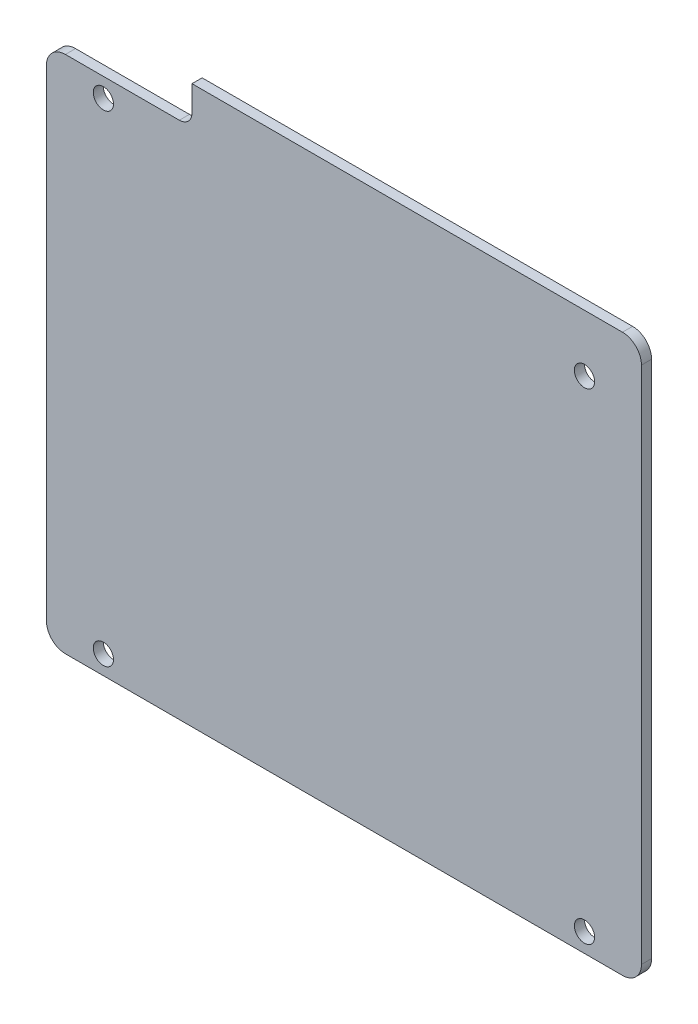
ISO-10303-21;
HEADER;
FILE_DESCRIPTION(('STEP AP214'),'2;1');
FILE_NAME('part.step','',(''),(''),'','','');
FILE_SCHEMA(('AUTOMOTIVE_DESIGN { 1 0 10303 214 1 1 1 1 }'));
ENDSEC;
DATA;
#1=APPLICATION_CONTEXT('core data for automotive mechanical design processes');
#2=APPLICATION_PROTOCOL_DEFINITION('international standard','automotive_design',2000,#1);
#3=PRODUCT_CONTEXT('',#1,'mechanical');
#4=PRODUCT('Part','Part','',(#3));
#5=PRODUCT_RELATED_PRODUCT_CATEGORY('part','',(#4));
#6=PRODUCT_DEFINITION_FORMATION('','',#4);
#7=PRODUCT_DEFINITION_CONTEXT('part definition',#1,'design');
#8=PRODUCT_DEFINITION('design','',#6,#7);
#9=PRODUCT_DEFINITION_SHAPE('','',#8);
#10=(LENGTH_UNIT() NAMED_UNIT(*) SI_UNIT(.MILLI.,.METRE.));
#11=(NAMED_UNIT(*) PLANE_ANGLE_UNIT() SI_UNIT($,.RADIAN.));
#12=(NAMED_UNIT(*) SI_UNIT($,.STERADIAN.) SOLID_ANGLE_UNIT());
#13=UNCERTAINTY_MEASURE_WITH_UNIT(LENGTH_MEASURE(1.E-05),#10,'distance_accuracy_value','');
#14=(GEOMETRIC_REPRESENTATION_CONTEXT(3) GLOBAL_UNCERTAINTY_ASSIGNED_CONTEXT((#13)) GLOBAL_UNIT_ASSIGNED_CONTEXT((#10,
#11,#12)) REPRESENTATION_CONTEXT('',''));
#15=CARTESIAN_POINT('',(0.,0.,0.));
#16=DIRECTION('',(0.,0.,1.));
#17=DIRECTION('',(1.,0.,0.));
#18=AXIS2_PLACEMENT_3D('',#15,#16,#17);
#19=CARTESIAN_POINT('',(-64.5653438799531,91.9518569300749,1.6));
#20=DIRECTION('',(1.,0.,0.));
#21=DIRECTION('',(0.,0.,-1.));
#22=AXIS2_PLACEMENT_3D('',#19,#20,#21);
#23=PLANE('',#22);
#24=DIRECTION('',(0.,-1.,0.));
#25=VECTOR('',#24,1.);
#26=CARTESIAN_POINT('',(-64.5653438799531,91.9518569300749,0.));
#27=LINE('',#26,#25);
#28=CARTESIAN_POINT('',(-64.5653438799531,91.9518569300749,0.));
#29=VERTEX_POINT('',#28);
#30=CARTESIAN_POINT('',(-64.5653438799531,87.9518569300749,0.));
#31=VERTEX_POINT('',#30);
#32=EDGE_CURVE('E147',#29,#31,#27,.T.);
#33=ORIENTED_EDGE('',*,*,#32,.T.);
#34=DIRECTION('',(0.,0.,-1.));
#35=VECTOR('',#34,1.);
#36=CARTESIAN_POINT('',(-64.5653438799531,87.9518569300749,1.6));
#37=LINE('',#36,#35);
#38=CARTESIAN_POINT('',(-64.5653438799531,87.9518569300749,1.6));
#39=VERTEX_POINT('',#38);
#40=EDGE_CURVE('E11',#39,#31,#37,.T.);
#41=ORIENTED_EDGE('',*,*,#40,.F.);
#42=DIRECTION('',(0.,-1.,0.));
#43=VECTOR('',#42,1.);
#44=CARTESIAN_POINT('',(-64.5653438799531,91.9518569300749,1.6));
#45=LINE('',#44,#43);
#46=CARTESIAN_POINT('',(-64.5653438799531,91.9518569300749,1.6));
#47=VERTEX_POINT('',#46);
#48=EDGE_CURVE('E169',#47,#39,#45,.T.);
#49=ORIENTED_EDGE('',*,*,#48,.F.);
#50=DIRECTION('',(0.,0.,-1.));
#51=VECTOR('',#50,1.);
#52=CARTESIAN_POINT('',(-64.5653438799531,91.9518569300749,1.6));
#53=LINE('',#52,#51);
#54=EDGE_CURVE('E143',#47,#29,#53,.T.);
#55=ORIENTED_EDGE('',*,*,#54,.T.);
#56=EDGE_LOOP('',(#33,#41,#49,#55));
#57=FACE_BOUND('',#56,.T.);
#58=ADVANCED_FACE('F32',(#57),#23,.F.);
#59=CARTESIAN_POINT('',(-66.5653438799531,87.9518569300749,1.6));
#60=DIRECTION('',(0.,0.,-1.));
#61=DIRECTION('',(-1.,0.,0.));
#62=AXIS2_PLACEMENT_3D('',#59,#60,#61);
#63=CYLINDRICAL_SURFACE('',#62,2.);
#64=CARTESIAN_POINT('',(-66.5653438799531,87.9518569300749,0.));
#65=DIRECTION('',(0.,0.,-1.));
#66=DIRECTION('',(-1.,0.,0.));
#67=AXIS2_PLACEMENT_3D('',#64,#65,#66);
#68=CIRCLE('',#67,2.);
#69=CARTESIAN_POINT('',(-66.5653438799531,85.9518569300749,0.));
#70=VERTEX_POINT('',#69);
#71=EDGE_CURVE('E150',#31,#70,#68,.T.);
#72=ORIENTED_EDGE('',*,*,#71,.T.);
#73=DIRECTION('',(0.,0.,-1.));
#74=VECTOR('',#73,1.);
#75=CARTESIAN_POINT('',(-66.5653438799531,85.9518569300749,1.6));
#76=LINE('',#75,#74);
#77=CARTESIAN_POINT('',(-66.5653438799531,85.9518569300749,1.6));
#78=VERTEX_POINT('',#77);
#79=EDGE_CURVE('E40',#78,#70,#76,.T.);
#80=ORIENTED_EDGE('',*,*,#79,.F.);
#81=CARTESIAN_POINT('',(-66.5653438799531,87.9518569300749,1.6));
#82=DIRECTION('',(0.,0.,-1.));
#83=DIRECTION('',(-1.,0.,0.));
#84=AXIS2_PLACEMENT_3D('',#81,#82,#83);
#85=CIRCLE('',#84,2.);
#86=EDGE_CURVE('E98',#39,#78,#85,.T.);
#87=ORIENTED_EDGE('',*,*,#86,.F.);
#88=ORIENTED_EDGE('',*,*,#40,.T.);
#89=EDGE_LOOP('',(#72,#80,#87,#88));
#90=FACE_BOUND('',#89,.T.);
#91=ADVANCED_FACE('F281',(#90),#63,.F.);
#92=CARTESIAN_POINT('',(-66.5653438799531,85.9518569300749,1.6));
#93=DIRECTION('',(0.,-1.,0.));
#94=DIRECTION('',(0.,0.,-1.));
#95=AXIS2_PLACEMENT_3D('',#92,#93,#94);
#96=PLANE('',#95);
#97=DIRECTION('',(-1.,0.,0.));
#98=VECTOR('',#97,1.);
#99=CARTESIAN_POINT('',(-66.5653438799531,85.9518569300749,0.));
#100=LINE('',#99,#98);
#101=CARTESIAN_POINT('',(-84.5653438799531,85.9518569300749,0.));
#102=VERTEX_POINT('',#101);
#103=EDGE_CURVE('E153',#70,#102,#100,.T.);
#104=ORIENTED_EDGE('',*,*,#103,.T.);
#105=DIRECTION('',(0.,0.,-1.));
#106=VECTOR('',#105,1.);
#107=CARTESIAN_POINT('',(-84.5653438799531,85.9518569300749,1.6));
#108=LINE('',#107,#106);
#109=CARTESIAN_POINT('',(-84.5653438799531,85.9518569300749,1.6));
#110=VERTEX_POINT('',#109);
#111=EDGE_CURVE('E185',#110,#102,#108,.T.);
#112=ORIENTED_EDGE('',*,*,#111,.F.);
#113=DIRECTION('',(-1.,0.,0.));
#114=VECTOR('',#113,1.);
#115=CARTESIAN_POINT('',(-66.5653438799531,85.9518569300749,1.6));
#116=LINE('',#115,#114);
#117=EDGE_CURVE('E193',#78,#110,#116,.T.);
#118=ORIENTED_EDGE('',*,*,#117,.F.);
#119=ORIENTED_EDGE('',*,*,#79,.T.);
#120=EDGE_LOOP('',(#104,#112,#118,#119));
#121=FACE_BOUND('',#120,.T.);
#122=ADVANCED_FACE('F191',(#121),#96,.F.);
#123=CARTESIAN_POINT('',(-84.5653438799531,82.9518569300749,1.6));
#124=DIRECTION('',(0.,0.,-1.));
#125=DIRECTION('',(-1.,0.,0.));
#126=AXIS2_PLACEMENT_3D('',#123,#124,#125);
#127=CYLINDRICAL_SURFACE('',#126,3.);
#128=CARTESIAN_POINT('',(-84.5653438799531,82.9518569300749,0.));
#129=DIRECTION('',(0.,0.,1.));
#130=DIRECTION('',(1.,0.,0.));
#131=AXIS2_PLACEMENT_3D('',#128,#129,#130);
#132=CIRCLE('',#131,3.);
#133=CARTESIAN_POINT('',(-87.5653438799531,82.9518569300748,0.));
#134=VERTEX_POINT('',#133);
#135=EDGE_CURVE('E155',#102,#134,#132,.T.);
#136=ORIENTED_EDGE('',*,*,#135,.T.);
#137=DIRECTION('',(0.,0.,-1.));
#138=VECTOR('',#137,1.);
#139=CARTESIAN_POINT('',(-87.5653438799531,82.9518569300748,1.6));
#140=LINE('',#139,#138);
#141=CARTESIAN_POINT('',(-87.5653438799531,82.9518569300748,1.6));
#142=VERTEX_POINT('',#141);
#143=EDGE_CURVE('E182',#142,#134,#140,.T.);
#144=ORIENTED_EDGE('',*,*,#143,.F.);
#145=CARTESIAN_POINT('',(-84.5653438799531,82.9518569300749,1.6));
#146=DIRECTION('',(0.,0.,1.));
#147=DIRECTION('',(1.,0.,0.));
#148=AXIS2_PLACEMENT_3D('',#145,#146,#147);
#149=CIRCLE('',#148,3.);
#150=EDGE_CURVE('E209',#110,#142,#149,.T.);
#151=ORIENTED_EDGE('',*,*,#150,.F.);
#152=ORIENTED_EDGE('',*,*,#111,.T.);
#153=EDGE_LOOP('',(#136,#144,#151,#152));
#154=FACE_BOUND('',#153,.T.);
#155=ADVANCED_FACE('F200',(#154),#127,.T.);
#156=CARTESIAN_POINT('',(-87.5653438799531,82.9518569300748,1.6));
#157=DIRECTION('',(1.,0.,0.));
#158=DIRECTION('',(0.,0.,-1.));
#159=AXIS2_PLACEMENT_3D('',#156,#157,#158);
#160=PLANE('',#159);
#161=DIRECTION('',(0.,-1.,0.));
#162=VECTOR('',#161,1.);
#163=CARTESIAN_POINT('',(-87.5653438799531,82.9518569300748,0.));
#164=LINE('',#163,#162);
#165=CARTESIAN_POINT('',(-87.5653438799531,6.95185693007492,0.));
#166=VERTEX_POINT('',#165);
#167=EDGE_CURVE('E157',#134,#166,#164,.T.);
#168=ORIENTED_EDGE('',*,*,#167,.T.);
#169=DIRECTION('',(0.,0.,-1.));
#170=VECTOR('',#169,1.);
#171=CARTESIAN_POINT('',(-87.5653438799531,6.95185693007492,1.6));
#172=LINE('',#171,#170);
#173=CARTESIAN_POINT('',(-87.5653438799531,6.95185693007492,1.6));
#174=VERTEX_POINT('',#173);
#175=EDGE_CURVE('E179',#174,#166,#172,.T.);
#176=ORIENTED_EDGE('',*,*,#175,.F.);
#177=DIRECTION('',(0.,-1.,0.));
#178=VECTOR('',#177,1.);
#179=CARTESIAN_POINT('',(-87.5653438799531,82.9518569300748,1.6));
#180=LINE('',#179,#178);
#181=EDGE_CURVE('E206',#142,#174,#180,.T.);
#182=ORIENTED_EDGE('',*,*,#181,.F.);
#183=ORIENTED_EDGE('',*,*,#143,.T.);
#184=EDGE_LOOP('',(#168,#176,#182,#183));
#185=FACE_BOUND('',#184,.T.);
#186=ADVANCED_FACE('F204',(#185),#160,.F.);
#187=CARTESIAN_POINT('',(-84.5653438799531,6.9518569300749,1.6));
#188=DIRECTION('',(0.,0.,-1.));
#189=DIRECTION('',(-1.,0.,0.));
#190=AXIS2_PLACEMENT_3D('',#187,#188,#189);
#191=CYLINDRICAL_SURFACE('',#190,3.);
#192=CARTESIAN_POINT('',(-84.5653438799531,6.9518569300749,0.));
#193=DIRECTION('',(0.,0.,1.));
#194=DIRECTION('',(-1.,0.,0.));
#195=AXIS2_PLACEMENT_3D('',#192,#193,#194);
#196=CIRCLE('',#195,3.);
#197=CARTESIAN_POINT('',(-84.5653438799531,3.9518569300749,0.));
#198=VERTEX_POINT('',#197);
#199=EDGE_CURVE('E159',#166,#198,#196,.T.);
#200=ORIENTED_EDGE('',*,*,#199,.T.);
#201=DIRECTION('',(0.,0.,-1.));
#202=VECTOR('',#201,1.);
#203=CARTESIAN_POINT('',(-84.5653438799531,3.9518569300749,1.6));
#204=LINE('',#203,#202);
#205=CARTESIAN_POINT('',(-84.5653438799531,3.9518569300749,1.6));
#206=VERTEX_POINT('',#205);
#207=EDGE_CURVE('E176',#206,#198,#204,.T.);
#208=ORIENTED_EDGE('',*,*,#207,.F.);
#209=CARTESIAN_POINT('',(-84.5653438799531,6.9518569300749,1.6));
#210=DIRECTION('',(0.,0.,1.));
#211=DIRECTION('',(-1.,0.,0.));
#212=AXIS2_PLACEMENT_3D('',#209,#210,#211);
#213=CIRCLE('',#212,3.);
#214=EDGE_CURVE('E208',#174,#206,#213,.T.);
#215=ORIENTED_EDGE('',*,*,#214,.F.);
#216=ORIENTED_EDGE('',*,*,#175,.T.);
#217=EDGE_LOOP('',(#200,#208,#215,#216));
#218=FACE_BOUND('',#217,.T.);
#219=ADVANCED_FACE('F294',(#218),#191,.T.);
#220=CARTESIAN_POINT('',(-84.5653438799531,3.9518569300749,1.6));
#221=DIRECTION('',(0.,1.,0.));
#222=DIRECTION('',(-1.,0.,0.));
#223=AXIS2_PLACEMENT_3D('',#220,#221,#222);
#224=PLANE('',#223);
#225=DIRECTION('',(1.,0.,0.));
#226=VECTOR('',#225,1.);
#227=CARTESIAN_POINT('',(-84.5653438799531,3.9518569300749,0.));
#228=LINE('',#227,#226);
#229=CARTESIAN_POINT('',(3.43465612004684,3.9518569300749,0.));
#230=VERTEX_POINT('',#229);
#231=EDGE_CURVE('E161',#198,#230,#228,.T.);
#232=ORIENTED_EDGE('',*,*,#231,.T.);
#233=DIRECTION('',(0.,0.,-1.));
#234=VECTOR('',#233,1.);
#235=CARTESIAN_POINT('',(3.43465612004684,3.9518569300749,1.6));
#236=LINE('',#235,#234);
#237=CARTESIAN_POINT('',(3.43465612004684,3.9518569300749,1.6));
#238=VERTEX_POINT('',#237);
#239=EDGE_CURVE('E173',#238,#230,#236,.T.);
#240=ORIENTED_EDGE('',*,*,#239,.F.);
#241=DIRECTION('',(1.,0.,0.));
#242=VECTOR('',#241,1.);
#243=CARTESIAN_POINT('',(-84.5653438799531,3.9518569300749,1.6));
#244=LINE('',#243,#242);
#245=EDGE_CURVE('E211',#206,#238,#244,.T.);
#246=ORIENTED_EDGE('',*,*,#245,.F.);
#247=ORIENTED_EDGE('',*,*,#207,.T.);
#248=EDGE_LOOP('',(#232,#240,#246,#247));
#249=FACE_BOUND('',#248,.T.);
#250=ADVANCED_FACE('F220',(#249),#224,.F.);
#251=CARTESIAN_POINT('',(3.43465612004684,6.9518569300749,1.6));
#252=DIRECTION('',(0.,0.,-1.));
#253=DIRECTION('',(-1.,0.,0.));
#254=AXIS2_PLACEMENT_3D('',#251,#252,#253);
#255=CYLINDRICAL_SURFACE('',#254,3.);
#256=CARTESIAN_POINT('',(3.43465612004684,6.9518569300749,0.));
#257=DIRECTION('',(0.,0.,1.));
#258=DIRECTION('',(1.,0.,0.));
#259=AXIS2_PLACEMENT_3D('',#256,#257,#258);
#260=CIRCLE('',#259,3.);
#261=CARTESIAN_POINT('',(6.43465612004684,6.9518569300749,0.));
#262=VERTEX_POINT('',#261);
#263=EDGE_CURVE('E163',#230,#262,#260,.T.);
#264=ORIENTED_EDGE('',*,*,#263,.T.);
#265=DIRECTION('',(0.,0.,-1.));
#266=VECTOR('',#265,1.);
#267=CARTESIAN_POINT('',(6.43465612004684,6.9518569300749,1.6));
#268=LINE('',#267,#266);
#269=CARTESIAN_POINT('',(6.43465612004684,6.9518569300749,1.6));
#270=VERTEX_POINT('',#269);
#271=EDGE_CURVE('E138',#270,#262,#268,.T.);
#272=ORIENTED_EDGE('',*,*,#271,.F.);
#273=CARTESIAN_POINT('',(3.43465612004684,6.9518569300749,1.6));
#274=DIRECTION('',(0.,0.,1.));
#275=DIRECTION('',(1.,0.,0.));
#276=AXIS2_PLACEMENT_3D('',#273,#274,#275);
#277=CIRCLE('',#276,3.);
#278=EDGE_CURVE('E127',#238,#270,#277,.T.);
#279=ORIENTED_EDGE('',*,*,#278,.F.);
#280=ORIENTED_EDGE('',*,*,#239,.T.);
#281=EDGE_LOOP('',(#264,#272,#279,#280));
#282=FACE_BOUND('',#281,.T.);
#283=ADVANCED_FACE('F224',(#282),#255,.T.);
#284=CARTESIAN_POINT('',(6.43465612004683,88.9518569300748,1.6));
#285=DIRECTION('',(-1.,0.,0.));
#286=DIRECTION('',(0.,-1.,0.));
#287=AXIS2_PLACEMENT_3D('',#284,#285,#286);
#288=PLANE('',#287);
#289=DIRECTION('',(0.,1.,0.));
#290=VECTOR('',#289,1.);
#291=CARTESIAN_POINT('',(6.43465612004683,88.9518569300748,0.));
#292=LINE('',#291,#290);
#293=CARTESIAN_POINT('',(6.43465612004683,88.9518569300748,0.));
#294=VERTEX_POINT('',#293);
#295=EDGE_CURVE('E136',#262,#294,#292,.T.);
#296=ORIENTED_EDGE('',*,*,#295,.T.);
#297=DIRECTION('',(0.,0.,-1.));
#298=VECTOR('',#297,1.);
#299=CARTESIAN_POINT('',(6.43465612004683,88.9518569300748,1.6));
#300=LINE('',#299,#298);
#301=CARTESIAN_POINT('',(6.43465612004683,88.9518569300748,1.6));
#302=VERTEX_POINT('',#301);
#303=EDGE_CURVE('E133',#302,#294,#300,.T.);
#304=ORIENTED_EDGE('',*,*,#303,.F.);
#305=DIRECTION('',(0.,1.,0.));
#306=VECTOR('',#305,1.);
#307=CARTESIAN_POINT('',(6.43465612004683,88.9518569300748,1.6));
#308=LINE('',#307,#306);
#309=EDGE_CURVE('E120',#270,#302,#308,.T.);
#310=ORIENTED_EDGE('',*,*,#309,.F.);
#311=ORIENTED_EDGE('',*,*,#271,.T.);
#312=EDGE_LOOP('',(#296,#304,#310,#311));
#313=FACE_BOUND('',#312,.T.);
#314=ADVANCED_FACE('F134',(#313),#288,.F.);
#315=CARTESIAN_POINT('',(3.43465612004683,88.9518569300749,1.6));
#316=DIRECTION('',(0.,0.,-1.));
#317=DIRECTION('',(-1.,0.,0.));
#318=AXIS2_PLACEMENT_3D('',#315,#316,#317);
#319=CYLINDRICAL_SURFACE('',#318,3.);
#320=CARTESIAN_POINT('',(3.43465612004683,88.9518569300749,0.));
#321=DIRECTION('',(0.,0.,1.));
#322=DIRECTION('',(-1.,0.,0.));
#323=AXIS2_PLACEMENT_3D('',#320,#321,#322);
#324=CIRCLE('',#323,3.);
#325=CARTESIAN_POINT('',(3.43465612004681,91.9518569300749,0.));
#326=VERTEX_POINT('',#325);
#327=EDGE_CURVE('E166',#294,#326,#324,.T.);
#328=ORIENTED_EDGE('',*,*,#327,.T.);
#329=DIRECTION('',(0.,0.,-1.));
#330=VECTOR('',#329,1.);
#331=CARTESIAN_POINT('',(3.43465612004681,91.9518569300749,1.6));
#332=LINE('',#331,#330);
#333=CARTESIAN_POINT('',(3.43465612004681,91.9518569300749,1.6));
#334=VERTEX_POINT('',#333);
#335=EDGE_CURVE('E139',#334,#326,#332,.T.);
#336=ORIENTED_EDGE('',*,*,#335,.F.);
#337=CARTESIAN_POINT('',(3.43465612004683,88.9518569300749,1.6));
#338=DIRECTION('',(0.,0.,1.));
#339=DIRECTION('',(-1.,0.,0.));
#340=AXIS2_PLACEMENT_3D('',#337,#338,#339);
#341=CIRCLE('',#340,3.);
#342=EDGE_CURVE('E124',#302,#334,#341,.T.);
#343=ORIENTED_EDGE('',*,*,#342,.F.);
#344=ORIENTED_EDGE('',*,*,#303,.T.);
#345=EDGE_LOOP('',(#328,#336,#343,#344));
#346=FACE_BOUND('',#345,.T.);
#347=ADVANCED_FACE('F141',(#346),#319,.T.);
#348=CARTESIAN_POINT('',(-64.5653438799531,91.9518569300749,1.6));
#349=DIRECTION('',(0.,-1.,0.));
#350=DIRECTION('',(0.,0.,-1.));
#351=AXIS2_PLACEMENT_3D('',#348,#349,#350);
#352=PLANE('',#351);
#353=DIRECTION('',(-1.,0.,0.));
#354=VECTOR('',#353,1.);
#355=CARTESIAN_POINT('',(-64.5653438799531,91.9518569300749,0.));
#356=LINE('',#355,#354);
#357=EDGE_CURVE('E86',#326,#29,#356,.T.);
#358=ORIENTED_EDGE('',*,*,#357,.T.);
#359=ORIENTED_EDGE('',*,*,#54,.F.);
#360=DIRECTION('',(-1.,0.,0.));
#361=VECTOR('',#360,1.);
#362=CARTESIAN_POINT('',(0.934656120046839,91.9518569300749,1.6));
#363=LINE('',#362,#361);
#364=EDGE_CURVE('E48',#334,#47,#363,.T.);
#365=ORIENTED_EDGE('',*,*,#364,.F.);
#366=ORIENTED_EDGE('',*,*,#335,.T.);
#367=EDGE_LOOP('',(#358,#359,#365,#366));
#368=FACE_BOUND('',#367,.T.);
#369=ADVANCED_FACE('F225',(#368),#352,.F.);
#370=CARTESIAN_POINT('',(-66.5653438799531,87.9518569300749,1.6));
#371=DIRECTION('',(0.,0.,-1.));
#372=DIRECTION('',(-1.,0.,0.));
#373=AXIS2_PLACEMENT_3D('',#370,#371,#372);
#374=PLANE('',#373);
#375=CARTESIAN_POINT('',(-78.5653438799531,6.95185693007482,1.6));
#376=DIRECTION('',(0.,0.,-1.));
#377=DIRECTION('',(-1.,0.,0.));
#378=AXIS2_PLACEMENT_3D('',#375,#376,#377);
#379=CIRCLE('',#378,1.6);
#380=CARTESIAN_POINT('',(-80.1653438799531,6.95185693007482,1.6));
#381=VERTEX_POINT('',#380);
#382=EDGE_CURVE('E249',#381,#381,#379,.T.);
#383=ORIENTED_EDGE('',*,*,#382,.T.);
#384=EDGE_LOOP('',(#383));
#385=FACE_BOUND('',#384,.T.);
#386=CARTESIAN_POINT('',(-78.5653438799532,82.9518569300749,1.6));
#387=DIRECTION('',(0.,0.,-1.));
#388=DIRECTION('',(-1.,0.,0.));
#389=AXIS2_PLACEMENT_3D('',#386,#387,#388);
#390=CIRCLE('',#389,1.6);
#391=CARTESIAN_POINT('',(-80.1653438799532,82.9518569300749,1.6));
#392=VERTEX_POINT('',#391);
#393=EDGE_CURVE('E243',#392,#392,#390,.T.);
#394=ORIENTED_EDGE('',*,*,#393,.T.);
#395=EDGE_LOOP('',(#394));
#396=FACE_BOUND('',#395,.T.);
#397=CARTESIAN_POINT('',(-2.56534387995318,82.9518569300749,1.6));
#398=DIRECTION('',(0.,0.,-1.));
#399=DIRECTION('',(-1.,0.,0.));
#400=AXIS2_PLACEMENT_3D('',#397,#398,#399);
#401=CIRCLE('',#400,1.59999999999999);
#402=CARTESIAN_POINT('',(-4.16534387995318,82.9518569300749,1.6));
#403=VERTEX_POINT('',#402);
#404=EDGE_CURVE('E237',#403,#403,#401,.T.);
#405=ORIENTED_EDGE('',*,*,#404,.T.);
#406=EDGE_LOOP('',(#405));
#407=FACE_BOUND('',#406,.T.);
#408=CARTESIAN_POINT('',(-2.56534387995316,6.95185693007487,1.6));
#409=DIRECTION('',(0.,0.,-1.));
#410=DIRECTION('',(-1.,0.,0.));
#411=AXIS2_PLACEMENT_3D('',#408,#409,#410);
#412=CIRCLE('',#411,1.59999999999999);
#413=CARTESIAN_POINT('',(-4.16534387995316,6.95185693007487,1.6));
#414=VERTEX_POINT('',#413);
#415=EDGE_CURVE('E151',#414,#414,#412,.T.);
#416=ORIENTED_EDGE('',*,*,#415,.T.);
#417=EDGE_LOOP('',(#416));
#418=FACE_BOUND('',#417,.T.);
#419=ORIENTED_EDGE('',*,*,#48,.T.);
#420=ORIENTED_EDGE('',*,*,#86,.T.);
#421=ORIENTED_EDGE('',*,*,#117,.T.);
#422=ORIENTED_EDGE('',*,*,#150,.T.);
#423=ORIENTED_EDGE('',*,*,#181,.T.);
#424=ORIENTED_EDGE('',*,*,#214,.T.);
#425=ORIENTED_EDGE('',*,*,#245,.T.);
#426=ORIENTED_EDGE('',*,*,#278,.T.);
#427=ORIENTED_EDGE('',*,*,#309,.T.);
#428=ORIENTED_EDGE('',*,*,#342,.T.);
#429=ORIENTED_EDGE('',*,*,#364,.T.);
#430=EDGE_LOOP('',(#419,#420,#421,#422,#423,#424,#425,#426,#427,#428,#429));
#431=FACE_BOUND('',#430,.T.);
#432=ADVANCED_FACE('F122',(#385,#396,#407,#418,#431),#374,.F.);
#433=CARTESIAN_POINT('',(-66.5653438799531,87.9518569300749,0.));
#434=DIRECTION('',(0.,0.,-1.));
#435=DIRECTION('',(-1.,0.,0.));
#436=AXIS2_PLACEMENT_3D('',#433,#434,#435);
#437=PLANE('',#436);
#438=CARTESIAN_POINT('',(-78.5653438799531,6.95185693007482,0.));
#439=DIRECTION('',(0.,0.,-1.));
#440=DIRECTION('',(-1.,0.,0.));
#441=AXIS2_PLACEMENT_3D('',#438,#439,#440);
#442=CIRCLE('',#441,1.59999999999999);
#443=CARTESIAN_POINT('',(-80.1653438799531,6.95185693007482,0.));
#444=VERTEX_POINT('',#443);
#445=EDGE_CURVE('E252',#444,#444,#442,.T.);
#446=ORIENTED_EDGE('',*,*,#445,.F.);
#447=EDGE_LOOP('',(#446));
#448=FACE_BOUND('',#447,.T.);
#449=CARTESIAN_POINT('',(-78.5653438799532,82.9518569300749,0.));
#450=DIRECTION('',(0.,0.,-1.));
#451=DIRECTION('',(-1.,0.,0.));
#452=AXIS2_PLACEMENT_3D('',#449,#450,#451);
#453=CIRCLE('',#452,1.59999999999999);
#454=CARTESIAN_POINT('',(-80.1653438799532,82.9518569300749,0.));
#455=VERTEX_POINT('',#454);
#456=EDGE_CURVE('E246',#455,#455,#453,.T.);
#457=ORIENTED_EDGE('',*,*,#456,.F.);
#458=EDGE_LOOP('',(#457));
#459=FACE_BOUND('',#458,.T.);
#460=CARTESIAN_POINT('',(-2.56534387995318,82.9518569300749,0.));
#461=DIRECTION('',(0.,0.,-1.));
#462=DIRECTION('',(-1.,0.,0.));
#463=AXIS2_PLACEMENT_3D('',#460,#461,#462);
#464=CIRCLE('',#463,1.59999999999999);
#465=CARTESIAN_POINT('',(-4.16534387995317,82.9518569300749,0.));
#466=VERTEX_POINT('',#465);
#467=EDGE_CURVE('E240',#466,#466,#464,.T.);
#468=ORIENTED_EDGE('',*,*,#467,.F.);
#469=EDGE_LOOP('',(#468));
#470=FACE_BOUND('',#469,.T.);
#471=CARTESIAN_POINT('',(-2.56534387995316,6.95185693007487,0.));
#472=DIRECTION('',(0.,0.,-1.));
#473=DIRECTION('',(-1.,0.,0.));
#474=AXIS2_PLACEMENT_3D('',#471,#472,#473);
#475=CIRCLE('',#474,1.59999999999999);
#476=CARTESIAN_POINT('',(-4.16534387995315,6.95185693007487,0.));
#477=VERTEX_POINT('',#476);
#478=EDGE_CURVE('E234',#477,#477,#475,.T.);
#479=ORIENTED_EDGE('',*,*,#478,.F.);
#480=EDGE_LOOP('',(#479));
#481=FACE_BOUND('',#480,.T.);
#482=ORIENTED_EDGE('',*,*,#32,.F.);
#483=ORIENTED_EDGE('',*,*,#357,.F.);
#484=ORIENTED_EDGE('',*,*,#327,.F.);
#485=ORIENTED_EDGE('',*,*,#295,.F.);
#486=ORIENTED_EDGE('',*,*,#263,.F.);
#487=ORIENTED_EDGE('',*,*,#231,.F.);
#488=ORIENTED_EDGE('',*,*,#199,.F.);
#489=ORIENTED_EDGE('',*,*,#167,.F.);
#490=ORIENTED_EDGE('',*,*,#135,.F.);
#491=ORIENTED_EDGE('',*,*,#103,.F.);
#492=ORIENTED_EDGE('',*,*,#71,.F.);
#493=EDGE_LOOP('',(#482,#483,#484,#485,#486,#487,#488,#489,#490,#491,#492));
#494=FACE_BOUND('',#493,.T.);
#495=ADVANCED_FACE('F195',(#448,#459,#470,#481,#494),#437,.T.);
#496=CARTESIAN_POINT('',(-2.56534387995316,6.95185693007487,0.));
#497=DIRECTION('',(0.,0.,-1.));
#498=DIRECTION('',(-1.,0.,0.));
#499=AXIS2_PLACEMENT_3D('',#496,#497,#498);
#500=CYLINDRICAL_SURFACE('',#499,1.59999999999999);
#501=ORIENTED_EDGE('',*,*,#415,.F.);
#502=EDGE_LOOP('',(#501));
#503=FACE_BOUND('',#502,.T.);
#504=ORIENTED_EDGE('',*,*,#478,.T.);
#505=EDGE_LOOP('',(#504));
#506=FACE_BOUND('',#505,.T.);
#507=ADVANCED_FACE('F260',(#503,#506),#500,.F.);
#508=CARTESIAN_POINT('',(-2.56534387995318,82.9518569300749,0.));
#509=DIRECTION('',(0.,0.,-1.));
#510=DIRECTION('',(-1.,0.,0.));
#511=AXIS2_PLACEMENT_3D('',#508,#509,#510);
#512=CYLINDRICAL_SURFACE('',#511,1.59999999999999);
#513=ORIENTED_EDGE('',*,*,#404,.F.);
#514=EDGE_LOOP('',(#513));
#515=FACE_BOUND('',#514,.T.);
#516=ORIENTED_EDGE('',*,*,#467,.T.);
#517=EDGE_LOOP('',(#516));
#518=FACE_BOUND('',#517,.T.);
#519=ADVANCED_FACE('F269',(#515,#518),#512,.F.);
#520=CARTESIAN_POINT('',(-78.5653438799532,82.9518569300749,0.));
#521=DIRECTION('',(0.,0.,-1.));
#522=DIRECTION('',(-1.,0.,0.));
#523=AXIS2_PLACEMENT_3D('',#520,#521,#522);
#524=CYLINDRICAL_SURFACE('',#523,1.6);
#525=ORIENTED_EDGE('',*,*,#393,.F.);
#526=EDGE_LOOP('',(#525));
#527=FACE_BOUND('',#526,.T.);
#528=ORIENTED_EDGE('',*,*,#456,.T.);
#529=EDGE_LOOP('',(#528));
#530=FACE_BOUND('',#529,.T.);
#531=ADVANCED_FACE('F275',(#527,#530),#524,.F.);
#532=CARTESIAN_POINT('',(-78.5653438799531,6.95185693007482,0.));
#533=DIRECTION('',(0.,0.,-1.));
#534=DIRECTION('',(-1.,0.,0.));
#535=AXIS2_PLACEMENT_3D('',#532,#533,#534);
#536=CYLINDRICAL_SURFACE('',#535,1.6);
#537=ORIENTED_EDGE('',*,*,#382,.F.);
#538=EDGE_LOOP('',(#537));
#539=FACE_BOUND('',#538,.T.);
#540=ORIENTED_EDGE('',*,*,#445,.T.);
#541=EDGE_LOOP('',(#540));
#542=FACE_BOUND('',#541,.T.);
#543=ADVANCED_FACE('F256',(#539,#542),#536,.F.);
#544=CLOSED_SHELL('',(#58,#91,#122,#155,#186,#219,#250,#283,#314,#347,#369,#432,#495,#507,#519,
#531,#543));
#545=MANIFOLD_SOLID_BREP('B2',#544);
#546=ADVANCED_BREP_SHAPE_REPRESENTATION('',(#18,#545),#14);
#547=SHAPE_DEFINITION_REPRESENTATION(#9,#546);
ENDSEC;
END-ISO-10303-21;
